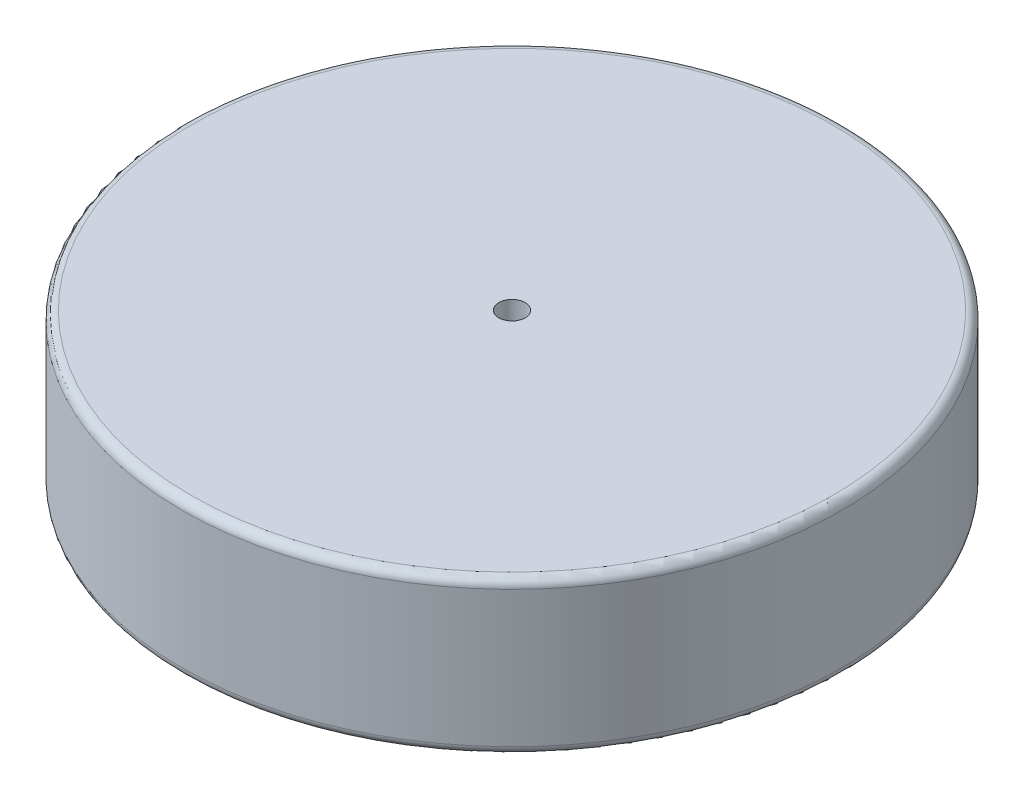
ISO-10303-21;
HEADER;
FILE_DESCRIPTION(('STEP AP214'),'2;1');
FILE_NAME('part.step','',(''),(''),'','','');
FILE_SCHEMA(('AUTOMOTIVE_DESIGN { 1 0 10303 214 1 1 1 1 }'));
ENDSEC;
DATA;
#1=APPLICATION_CONTEXT('core data for automotive mechanical design processes');
#2=APPLICATION_PROTOCOL_DEFINITION('international standard','automotive_design',2000,#1);
#3=PRODUCT_CONTEXT('',#1,'mechanical');
#4=PRODUCT('Part','Part','',(#3));
#5=PRODUCT_RELATED_PRODUCT_CATEGORY('part','',(#4));
#6=PRODUCT_DEFINITION_FORMATION('','',#4);
#7=PRODUCT_DEFINITION_CONTEXT('part definition',#1,'design');
#8=PRODUCT_DEFINITION('design','',#6,#7);
#9=PRODUCT_DEFINITION_SHAPE('','',#8);
#10=(LENGTH_UNIT() NAMED_UNIT(*) SI_UNIT(.MILLI.,.METRE.));
#11=(NAMED_UNIT(*) PLANE_ANGLE_UNIT() SI_UNIT($,.RADIAN.));
#12=(NAMED_UNIT(*) SI_UNIT($,.STERADIAN.) SOLID_ANGLE_UNIT());
#13=UNCERTAINTY_MEASURE_WITH_UNIT(LENGTH_MEASURE(1.E-05),#10,'distance_accuracy_value','');
#14=(GEOMETRIC_REPRESENTATION_CONTEXT(3) GLOBAL_UNCERTAINTY_ASSIGNED_CONTEXT((#13)) GLOBAL_UNIT_ASSIGNED_CONTEXT((#10,
#11,#12)) REPRESENTATION_CONTEXT('',''));
#15=CARTESIAN_POINT('',(0.,0.,0.));
#16=DIRECTION('',(0.,0.,1.));
#17=DIRECTION('',(1.,0.,0.));
#18=AXIS2_PLACEMENT_3D('',#15,#16,#17);
#19=CARTESIAN_POINT('',(0.,35.,0.));
#20=DIRECTION('',(0.,1.,0.));
#21=DIRECTION('',(0.,0.,1.));
#22=AXIS2_PLACEMENT_3D('',#19,#20,#21);
#23=PLANE('',#22);
#24=CARTESIAN_POINT('',(0.,35.,0.));
#25=DIRECTION('',(0.,1.,0.));
#26=DIRECTION('',(0.,0.,1.));
#27=AXIS2_PLACEMENT_3D('',#24,#25,#26);
#28=CIRCLE('',#27,73.);
#29=CARTESIAN_POINT('',(0.,35.,73.));
#30=VERTEX_POINT('',#29);
#31=EDGE_CURVE('E65',#30,#30,#28,.T.);
#32=ORIENTED_EDGE('',*,*,#31,.T.);
#33=EDGE_LOOP('',(#32));
#34=FACE_BOUND('',#33,.T.);
#35=CARTESIAN_POINT('',(0.,35.,0.));
#36=DIRECTION('',(0.,1.,0.));
#37=DIRECTION('',(0.,0.,1.));
#38=AXIS2_PLACEMENT_3D('',#35,#36,#37);
#39=CIRCLE('',#38,3.);
#40=CARTESIAN_POINT('',(0.,35.,3.));
#41=VERTEX_POINT('',#40);
#42=EDGE_CURVE('E71',#41,#41,#39,.T.);
#43=ORIENTED_EDGE('',*,*,#42,.F.);
#44=EDGE_LOOP('',(#43));
#45=FACE_BOUND('',#44,.T.);
#46=ADVANCED_FACE('F47',(#34,#45),#23,.T.);
#47=CARTESIAN_POINT('',(0.,0.,0.));
#48=DIRECTION('',(0.,1.,0.));
#49=DIRECTION('',(0.,0.,1.));
#50=AXIS2_PLACEMENT_3D('',#47,#48,#49);
#51=PLANE('',#50);
#52=CARTESIAN_POINT('',(0.,0.,0.));
#53=DIRECTION('',(0.,1.,0.));
#54=DIRECTION('',(0.,0.,1.));
#55=AXIS2_PLACEMENT_3D('',#52,#53,#54);
#56=CIRCLE('',#55,73.);
#57=CARTESIAN_POINT('',(0.,0.,73.));
#58=VERTEX_POINT('',#57);
#59=EDGE_CURVE('E10',#58,#58,#56,.F.);
#60=ORIENTED_EDGE('',*,*,#59,.T.);
#61=EDGE_LOOP('',(#60));
#62=FACE_BOUND('',#61,.T.);
#63=CARTESIAN_POINT('',(0.,0.,0.));
#64=DIRECTION('',(0.,1.,0.));
#65=DIRECTION('',(0.,0.,1.));
#66=AXIS2_PLACEMENT_3D('',#63,#64,#65);
#67=CIRCLE('',#66,3.);
#68=CARTESIAN_POINT('',(0.,0.,3.));
#69=VERTEX_POINT('',#68);
#70=EDGE_CURVE('E72',#69,#69,#67,.T.);
#71=ORIENTED_EDGE('',*,*,#70,.T.);
#72=EDGE_LOOP('',(#71));
#73=FACE_BOUND('',#72,.T.);
#74=ADVANCED_FACE('F84',(#62,#73),#51,.F.);
#75=CARTESIAN_POINT('',(0.,35.,0.));
#76=DIRECTION('',(0.,-1.,0.));
#77=DIRECTION('',(0.,0.,-1.));
#78=AXIS2_PLACEMENT_3D('',#75,#76,#77);
#79=CYLINDRICAL_SURFACE('',#78,75.);
#80=CARTESIAN_POINT('',(0.,33.,0.));
#81=DIRECTION('',(0.,1.,0.));
#82=DIRECTION('',(0.,0.,1.));
#83=AXIS2_PLACEMENT_3D('',#80,#81,#82);
#84=CIRCLE('',#83,75.);
#85=CARTESIAN_POINT('',(0.,33.,75.));
#86=VERTEX_POINT('',#85);
#87=EDGE_CURVE('E55',#86,#86,#84,.F.);
#88=ORIENTED_EDGE('',*,*,#87,.T.);
#89=EDGE_LOOP('',(#88));
#90=FACE_BOUND('',#89,.T.);
#91=CARTESIAN_POINT('',(0.,2.,0.));
#92=DIRECTION('',(0.,1.,0.));
#93=DIRECTION('',(0.,0.,1.));
#94=AXIS2_PLACEMENT_3D('',#91,#92,#93);
#95=CIRCLE('',#94,75.);
#96=CARTESIAN_POINT('',(0.,2.,75.));
#97=VERTEX_POINT('',#96);
#98=EDGE_CURVE('E60',#97,#97,#95,.T.);
#99=ORIENTED_EDGE('',*,*,#98,.T.);
#100=EDGE_LOOP('',(#99));
#101=FACE_BOUND('',#100,.T.);
#102=ADVANCED_FACE('F90',(#90,#101),#79,.T.);
#103=CARTESIAN_POINT('',(0.,35.,0.));
#104=DIRECTION('',(0.,-1.,0.));
#105=DIRECTION('',(0.,0.,-1.));
#106=AXIS2_PLACEMENT_3D('',#103,#104,#105);
#107=CYLINDRICAL_SURFACE('',#106,3.);
#108=ORIENTED_EDGE('',*,*,#42,.T.);
#109=EDGE_LOOP('',(#108));
#110=FACE_BOUND('',#109,.T.);
#111=ORIENTED_EDGE('',*,*,#70,.F.);
#112=EDGE_LOOP('',(#111));
#113=FACE_BOUND('',#112,.T.);
#114=ADVANCED_FACE('F80',(#110,#113),#107,.F.);
#115=CARTESIAN_POINT('',(0.,33.,0.));
#116=DIRECTION('',(0.,1.,0.));
#117=DIRECTION('',(0.,0.,1.));
#118=AXIS2_PLACEMENT_3D('',#115,#116,#117);
#119=TOROIDAL_SURFACE('',#118,73.,2.);
#120=ORIENTED_EDGE('',*,*,#87,.F.);
#121=EDGE_LOOP('',(#120));
#122=FACE_BOUND('',#121,.T.);
#123=ORIENTED_EDGE('',*,*,#31,.F.);
#124=EDGE_LOOP('',(#123));
#125=FACE_BOUND('',#124,.T.);
#126=ADVANCED_FACE('F95',(#122,#125),#119,.T.);
#127=CARTESIAN_POINT('',(0.,2.,0.));
#128=DIRECTION('',(0.,1.,0.));
#129=DIRECTION('',(0.,0.,1.));
#130=AXIS2_PLACEMENT_3D('',#127,#128,#129);
#131=TOROIDAL_SURFACE('',#130,73.,2.);
#132=ORIENTED_EDGE('',*,*,#59,.F.);
#133=EDGE_LOOP('',(#132));
#134=FACE_BOUND('',#133,.T.);
#135=ORIENTED_EDGE('',*,*,#98,.F.);
#136=EDGE_LOOP('',(#135));
#137=FACE_BOUND('',#136,.T.);
#138=ADVANCED_FACE('F49',(#134,#137),#131,.T.);
#139=CLOSED_SHELL('',(#46,#74,#102,#114,#126,#138));
#140=MANIFOLD_SOLID_BREP('B2',#139);
#141=ADVANCED_BREP_SHAPE_REPRESENTATION('',(#18,#140),#14);
#142=SHAPE_DEFINITION_REPRESENTATION(#9,#141);
ENDSEC;
END-ISO-10303-21;
